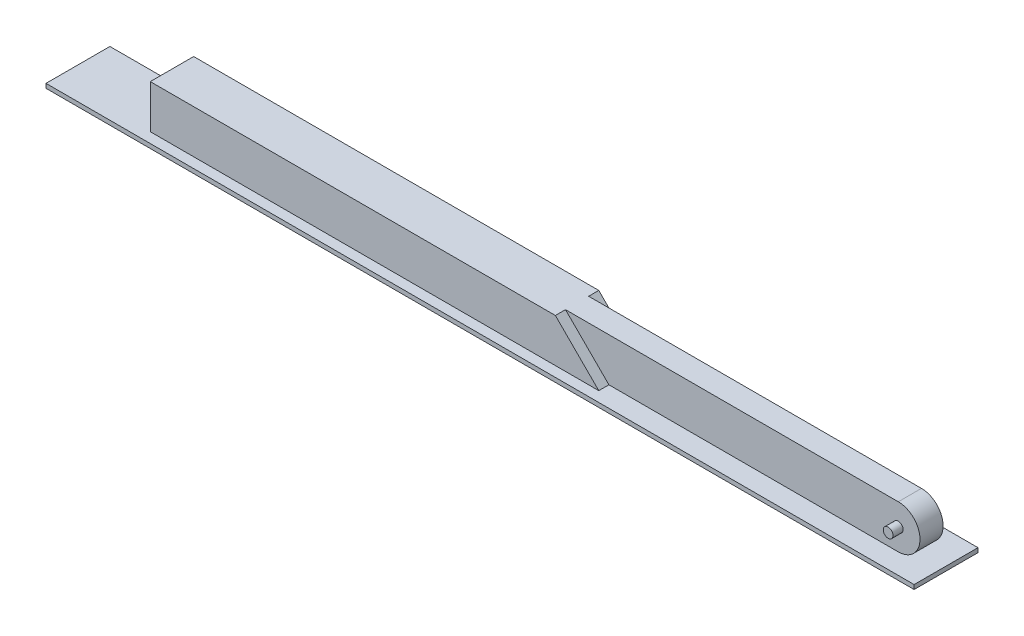
ISO-10303-21;
HEADER;
FILE_DESCRIPTION(('STEP AP214'),'2;1');
FILE_NAME('part.step','',(''),(''),'','','');
FILE_SCHEMA(('AUTOMOTIVE_DESIGN { 1 0 10303 214 1 1 1 1 }'));
ENDSEC;
DATA;
#1=APPLICATION_CONTEXT('core data for automotive mechanical design processes');
#2=APPLICATION_PROTOCOL_DEFINITION('international standard','automotive_design',2000,#1);
#3=PRODUCT_CONTEXT('',#1,'mechanical');
#4=PRODUCT('Part','Part','',(#3));
#5=PRODUCT_RELATED_PRODUCT_CATEGORY('part','',(#4));
#6=PRODUCT_DEFINITION_FORMATION('','',#4);
#7=PRODUCT_DEFINITION_CONTEXT('part definition',#1,'design');
#8=PRODUCT_DEFINITION('design','',#6,#7);
#9=PRODUCT_DEFINITION_SHAPE('','',#8);
#10=(LENGTH_UNIT() NAMED_UNIT(*) SI_UNIT(.MILLI.,.METRE.));
#11=(NAMED_UNIT(*) PLANE_ANGLE_UNIT() SI_UNIT($,.RADIAN.));
#12=(NAMED_UNIT(*) SI_UNIT($,.STERADIAN.) SOLID_ANGLE_UNIT());
#13=UNCERTAINTY_MEASURE_WITH_UNIT(LENGTH_MEASURE(1.E-05),#10,'distance_accuracy_value','');
#14=(GEOMETRIC_REPRESENTATION_CONTEXT(3) GLOBAL_UNCERTAINTY_ASSIGNED_CONTEXT((#13)) GLOBAL_UNIT_ASSIGNED_CONTEXT((#10,
#11,#12)) REPRESENTATION_CONTEXT('',''));
#15=CARTESIAN_POINT('',(0.,0.,0.));
#16=DIRECTION('',(0.,0.,1.));
#17=DIRECTION('',(1.,0.,0.));
#18=AXIS2_PLACEMENT_3D('',#15,#16,#17);
#19=CARTESIAN_POINT('',(225.,0.,15.));
#20=DIRECTION('',(0.,0.,-1.));
#21=DIRECTION('',(-1.,0.,0.));
#22=AXIS2_PLACEMENT_3D('',#19,#20,#21);
#23=CYLINDRICAL_SURFACE('',#22,15.);
#24=DIRECTION('',(0.,0.,-1.));
#25=VECTOR('',#24,1.);
#26=CARTESIAN_POINT('',(225.,-14.9999999999999,15.));
#27=LINE('',#26,#25);
#28=CARTESIAN_POINT('',(225.,-15.,8.));
#29=VERTEX_POINT('',#28);
#30=CARTESIAN_POINT('',(225.,-15.,-8.));
#31=VERTEX_POINT('',#30);
#32=EDGE_CURVE('E272',#29,#31,#27,.T.);
#33=ORIENTED_EDGE('',*,*,#32,.T.);
#34=CARTESIAN_POINT('',(225.,0.,-8.));
#35=DIRECTION('',(0.,0.,1.));
#36=DIRECTION('',(1.,0.,0.));
#37=AXIS2_PLACEMENT_3D('',#34,#35,#36);
#38=CIRCLE('',#37,15.);
#39=CARTESIAN_POINT('',(225.,15.0000000000001,-8.));
#40=VERTEX_POINT('',#39);
#41=EDGE_CURVE('E263',#31,#40,#38,.T.);
#42=ORIENTED_EDGE('',*,*,#41,.T.);
#43=DIRECTION('',(0.,0.,-1.));
#44=VECTOR('',#43,1.);
#45=CARTESIAN_POINT('',(225.,15.0000000000001,15.));
#46=LINE('',#45,#44);
#47=CARTESIAN_POINT('',(225.,15.0000000000001,8.));
#48=VERTEX_POINT('',#47);
#49=EDGE_CURVE('E269',#48,#40,#46,.T.);
#50=ORIENTED_EDGE('',*,*,#49,.F.);
#51=CARTESIAN_POINT('',(225.,0.,8.));
#52=DIRECTION('',(0.,0.,-1.));
#53=DIRECTION('',(-1.,0.,0.));
#54=AXIS2_PLACEMENT_3D('',#51,#52,#53);
#55=CIRCLE('',#54,15.);
#56=EDGE_CURVE('E259',#48,#29,#55,.T.);
#57=ORIENTED_EDGE('',*,*,#56,.T.);
#58=EDGE_LOOP('',(#33,#42,#50,#57));
#59=FACE_BOUND('',#58,.T.);
#60=ADVANCED_FACE('F37',(#59),#23,.T.);
#61=CARTESIAN_POINT('',(-225.,15.,15.));
#62=DIRECTION('',(0.,-1.,0.));
#63=DIRECTION('',(1.,0.,0.));
#64=AXIS2_PLACEMENT_3D('',#61,#62,#63);
#65=PLANE('',#64);
#66=DIRECTION('',(-1.,0.,0.));
#67=VECTOR('',#66,1.);
#68=CARTESIAN_POINT('',(-225.,15.,15.));
#69=LINE('',#68,#67);
#70=CARTESIAN_POINT('',(-5.00000000000014,15.,15.));
#71=VERTEX_POINT('',#70);
#72=CARTESIAN_POINT('',(-285.,15.,15.));
#73=VERTEX_POINT('',#72);
#74=EDGE_CURVE('E267',#71,#73,#69,.T.);
#75=ORIENTED_EDGE('',*,*,#74,.F.);
#76=DIRECTION('',(0.,0.,-1.));
#77=VECTOR('',#76,1.);
#78=CARTESIAN_POINT('',(-5.00000000000014,15.,15.));
#79=LINE('',#78,#77);
#80=CARTESIAN_POINT('',(-5.00000000000014,15.,8.));
#81=VERTEX_POINT('',#80);
#82=EDGE_CURVE('E282',#71,#81,#79,.T.);
#83=ORIENTED_EDGE('',*,*,#82,.T.);
#84=DIRECTION('',(-1.,0.,0.));
#85=VECTOR('',#84,1.);
#86=CARTESIAN_POINT('',(25.,15.,8.));
#87=LINE('',#86,#85);
#88=EDGE_CURVE('E53',#48,#81,#87,.T.);
#89=ORIENTED_EDGE('',*,*,#88,.F.);
#90=ORIENTED_EDGE('',*,*,#49,.T.);
#91=DIRECTION('',(1.,0.,0.));
#92=VECTOR('',#91,1.);
#93=CARTESIAN_POINT('',(25.,15.,-8.));
#94=LINE('',#93,#92);
#95=CARTESIAN_POINT('',(-5.00000000000014,15.,-8.));
#96=VERTEX_POINT('',#95);
#97=EDGE_CURVE('E61',#96,#40,#94,.T.);
#98=ORIENTED_EDGE('',*,*,#97,.F.);
#99=DIRECTION('',(0.,0.,-1.));
#100=VECTOR('',#99,1.);
#101=CARTESIAN_POINT('',(-5.00000000000014,15.,15.));
#102=LINE('',#101,#100);
#103=CARTESIAN_POINT('',(-5.00000000000014,15.,-15.));
#104=VERTEX_POINT('',#103);
#105=EDGE_CURVE('E280',#96,#104,#102,.T.);
#106=ORIENTED_EDGE('',*,*,#105,.T.);
#107=DIRECTION('',(-1.,0.,0.));
#108=VECTOR('',#107,1.);
#109=CARTESIAN_POINT('',(-225.,15.,-15.));
#110=LINE('',#109,#108);
#111=CARTESIAN_POINT('',(-285.,15.,-15.));
#112=VERTEX_POINT('',#111);
#113=EDGE_CURVE('E266',#104,#112,#110,.T.);
#114=ORIENTED_EDGE('',*,*,#113,.T.);
#115=DIRECTION('',(0.,0.,-1.));
#116=VECTOR('',#115,1.);
#117=CARTESIAN_POINT('',(-285.,15.,-66.2219080242626));
#118=LINE('',#117,#116);
#119=EDGE_CURVE('E192',#73,#112,#118,.T.);
#120=ORIENTED_EDGE('',*,*,#119,.F.);
#121=EDGE_LOOP('',(#75,#83,#89,#90,#98,#106,#114,#120));
#122=FACE_BOUND('',#121,.T.);
#123=ADVANCED_FACE('F315',(#122),#65,.F.);
#124=CARTESIAN_POINT('',(-225.,0.,15.));
#125=DIRECTION('',(0.,0.,1.));
#126=DIRECTION('',(1.,0.,0.));
#127=AXIS2_PLACEMENT_3D('',#124,#125,#126);
#128=PLANE('',#127);
#129=DIRECTION('',(1.,0.,0.));
#130=VECTOR('',#129,1.);
#131=CARTESIAN_POINT('',(-225.,-15.,15.));
#132=LINE('',#131,#130);
#133=CARTESIAN_POINT('',(-285.,-15.,15.));
#134=VERTEX_POINT('',#133);
#135=CARTESIAN_POINT('',(25.,-15.,15.));
#136=VERTEX_POINT('',#135);
#137=EDGE_CURVE('E241',#134,#136,#132,.T.);
#138=ORIENTED_EDGE('',*,*,#137,.T.);
#139=DIRECTION('',(0.707106781186548,-0.707106781186547,0.));
#140=VECTOR('',#139,1.);
#141=CARTESIAN_POINT('',(-107.5,117.5,15.));
#142=LINE('',#141,#140);
#143=EDGE_CURVE('E274',#136,#71,#142,.F.);
#144=ORIENTED_EDGE('',*,*,#143,.T.);
#145=ORIENTED_EDGE('',*,*,#74,.T.);
#146=DIRECTION('',(0.,1.,0.));
#147=VECTOR('',#146,1.);
#148=CARTESIAN_POINT('',(-285.,0.,15.));
#149=LINE('',#148,#147);
#150=EDGE_CURVE('E205',#134,#73,#149,.T.);
#151=ORIENTED_EDGE('',*,*,#150,.F.);
#152=EDGE_LOOP('',(#138,#144,#145,#151));
#153=FACE_BOUND('',#152,.T.);
#154=ADVANCED_FACE('F299',(#153),#128,.T.);
#155=CARTESIAN_POINT('',(-225.,0.,-15.));
#156=DIRECTION('',(0.,0.,1.));
#157=DIRECTION('',(1.,0.,0.));
#158=AXIS2_PLACEMENT_3D('',#155,#156,#157);
#159=PLANE('',#158);
#160=ORIENTED_EDGE('',*,*,#113,.F.);
#161=DIRECTION('',(-0.707106781186548,0.707106781186547,0.));
#162=VECTOR('',#161,1.);
#163=CARTESIAN_POINT('',(25.,-15.,-15.));
#164=LINE('',#163,#162);
#165=CARTESIAN_POINT('',(25.,-15.,-15.));
#166=VERTEX_POINT('',#165);
#167=EDGE_CURVE('E284',#104,#166,#164,.F.);
#168=ORIENTED_EDGE('',*,*,#167,.T.);
#169=DIRECTION('',(1.,0.,0.));
#170=VECTOR('',#169,1.);
#171=CARTESIAN_POINT('',(-225.,-15.,-15.));
#172=LINE('',#171,#170);
#173=CARTESIAN_POINT('',(-285.,-15.,-15.));
#174=VERTEX_POINT('',#173);
#175=EDGE_CURVE('E238',#174,#166,#172,.T.);
#176=ORIENTED_EDGE('',*,*,#175,.F.);
#177=DIRECTION('',(0.,1.,0.));
#178=VECTOR('',#177,1.);
#179=CARTESIAN_POINT('',(-285.,0.,-15.));
#180=LINE('',#179,#178);
#181=EDGE_CURVE('E202',#174,#112,#180,.T.);
#182=ORIENTED_EDGE('',*,*,#181,.T.);
#183=EDGE_LOOP('',(#160,#168,#176,#182));
#184=FACE_BOUND('',#183,.T.);
#185=ADVANCED_FACE('F305',(#184),#159,.F.);
#186=CARTESIAN_POINT('',(25.,-15.,8.));
#187=DIRECTION('',(0.,0.,-1.));
#188=DIRECTION('',(-1.,0.,0.));
#189=AXIS2_PLACEMENT_3D('',#186,#187,#188);
#190=PLANE('',#189);
#191=CARTESIAN_POINT('',(225.,0.,8.));
#192=DIRECTION('',(0.,0.,-1.));
#193=DIRECTION('',(-1.,0.,0.));
#194=AXIS2_PLACEMENT_3D('',#191,#192,#193);
#195=CIRCLE('',#194,3.3782);
#196=CARTESIAN_POINT('',(221.6218,0.,8.));
#197=VERTEX_POINT('',#196);
#198=EDGE_CURVE('E250',#197,#197,#195,.F.);
#199=ORIENTED_EDGE('',*,*,#198,.F.);
#200=EDGE_LOOP('',(#199));
#201=FACE_BOUND('',#200,.T.);
#202=ORIENTED_EDGE('',*,*,#88,.T.);
#203=DIRECTION('',(-0.707106781186548,0.707106781186547,0.));
#204=VECTOR('',#203,1.);
#205=CARTESIAN_POINT('',(25.,-15.,8.));
#206=LINE('',#205,#204);
#207=CARTESIAN_POINT('',(25.,-15.,8.));
#208=VERTEX_POINT('',#207);
#209=EDGE_CURVE('E46',#81,#208,#206,.F.);
#210=ORIENTED_EDGE('',*,*,#209,.T.);
#211=DIRECTION('',(-1.,0.,0.));
#212=VECTOR('',#211,1.);
#213=CARTESIAN_POINT('',(25.,-15.,8.));
#214=LINE('',#213,#212);
#215=EDGE_CURVE('E252',#29,#208,#214,.T.);
#216=ORIENTED_EDGE('',*,*,#215,.F.);
#217=ORIENTED_EDGE('',*,*,#56,.F.);
#218=EDGE_LOOP('',(#202,#210,#216,#217));
#219=FACE_BOUND('',#218,.T.);
#220=ADVANCED_FACE('F286',(#201,#219),#190,.F.);
#221=CARTESIAN_POINT('',(25.,-15.,-8.));
#222=DIRECTION('',(0.,0.,1.));
#223=DIRECTION('',(1.,0.,0.));
#224=AXIS2_PLACEMENT_3D('',#221,#222,#223);
#225=PLANE('',#224);
#226=CARTESIAN_POINT('',(225.,0.,-8.));
#227=DIRECTION('',(0.,0.,1.));
#228=DIRECTION('',(1.,0.,0.));
#229=AXIS2_PLACEMENT_3D('',#226,#227,#228);
#230=CIRCLE('',#229,3.3782);
#231=CARTESIAN_POINT('',(228.3782,0.,-8.));
#232=VERTEX_POINT('',#231);
#233=EDGE_CURVE('E262',#232,#232,#230,.F.);
#234=ORIENTED_EDGE('',*,*,#233,.F.);
#235=EDGE_LOOP('',(#234));
#236=FACE_BOUND('',#235,.T.);
#237=DIRECTION('',(1.,0.,0.));
#238=VECTOR('',#237,1.);
#239=CARTESIAN_POINT('',(25.,-15.,-8.));
#240=LINE('',#239,#238);
#241=CARTESIAN_POINT('',(25.,-15.,-8.));
#242=VERTEX_POINT('',#241);
#243=EDGE_CURVE('E247',#242,#31,#240,.T.);
#244=ORIENTED_EDGE('',*,*,#243,.F.);
#245=DIRECTION('',(0.707106781186548,-0.707106781186547,0.));
#246=VECTOR('',#245,1.);
#247=CARTESIAN_POINT('',(25.,-15.,-8.));
#248=LINE('',#247,#246);
#249=EDGE_CURVE('E11',#242,#96,#248,.F.);
#250=ORIENTED_EDGE('',*,*,#249,.T.);
#251=ORIENTED_EDGE('',*,*,#97,.T.);
#252=ORIENTED_EDGE('',*,*,#41,.F.);
#253=EDGE_LOOP('',(#244,#250,#251,#252));
#254=FACE_BOUND('',#253,.T.);
#255=ADVANCED_FACE('F312',(#236,#254),#225,.F.);
#256=CARTESIAN_POINT('',(250.02,-17.9999999999999,22.0794863015094));
#257=DIRECTION('',(-1.,0.,0.));
#258=DIRECTION('',(0.,-1.,0.));
#259=AXIS2_PLACEMENT_3D('',#256,#257,#258);
#260=PLANE('',#259);
#261=DIRECTION('',(0.,0.,1.));
#262=VECTOR('',#261,1.);
#263=CARTESIAN_POINT('',(250.02,-14.9999999999999,22.0794863015094));
#264=LINE('',#263,#262);
#265=CARTESIAN_POINT('',(250.02,-14.9999999999999,-22.0794863015094));
#266=VERTEX_POINT('',#265);
#267=CARTESIAN_POINT('',(250.02,-14.9999999999999,22.0794863015094));
#268=VERTEX_POINT('',#267);
#269=EDGE_CURVE('E208',#266,#268,#264,.T.);
#270=ORIENTED_EDGE('',*,*,#269,.T.);
#271=DIRECTION('',(0.,1.,0.));
#272=VECTOR('',#271,1.);
#273=CARTESIAN_POINT('',(250.02,-17.9999999999999,22.0794863015094));
#274=LINE('',#273,#272);
#275=CARTESIAN_POINT('',(250.02,-17.9999999999999,22.0794863015094));
#276=VERTEX_POINT('',#275);
#277=EDGE_CURVE('E235',#276,#268,#274,.T.);
#278=ORIENTED_EDGE('',*,*,#277,.F.);
#279=DIRECTION('',(0.,0.,1.));
#280=VECTOR('',#279,1.);
#281=CARTESIAN_POINT('',(250.02,-17.9999999999999,22.0794863015094));
#282=LINE('',#281,#280);
#283=CARTESIAN_POINT('',(250.02,-17.9999999999999,-22.0794863015094));
#284=VERTEX_POINT('',#283);
#285=EDGE_CURVE('E209',#284,#276,#282,.T.);
#286=ORIENTED_EDGE('',*,*,#285,.F.);
#287=DIRECTION('',(0.,1.,0.));
#288=VECTOR('',#287,1.);
#289=CARTESIAN_POINT('',(250.02,-17.9999999999999,-22.0794863015094));
#290=LINE('',#289,#288);
#291=EDGE_CURVE('E219',#284,#266,#290,.T.);
#292=ORIENTED_EDGE('',*,*,#291,.T.);
#293=EDGE_LOOP('',(#270,#278,#286,#292));
#294=FACE_BOUND('',#293,.T.);
#295=ADVANCED_FACE('F390',(#294),#260,.F.);
#296=CARTESIAN_POINT('',(-349.98,-18.,22.0794863015093));
#297=DIRECTION('',(0.,0.,-1.));
#298=DIRECTION('',(-1.,0.,0.));
#299=AXIS2_PLACEMENT_3D('',#296,#297,#298);
#300=PLANE('',#299);
#301=DIRECTION('',(-1.,0.,0.));
#302=VECTOR('',#301,1.);
#303=CARTESIAN_POINT('',(-349.98,-15.,22.0794863015093));
#304=LINE('',#303,#302);
#305=CARTESIAN_POINT('',(-349.98,-15.,22.0794863015093));
#306=VERTEX_POINT('',#305);
#307=EDGE_CURVE('E222',#268,#306,#304,.T.);
#308=ORIENTED_EDGE('',*,*,#307,.T.);
#309=DIRECTION('',(0.,1.,0.));
#310=VECTOR('',#309,1.);
#311=CARTESIAN_POINT('',(-349.98,-18.,22.0794863015093));
#312=LINE('',#311,#310);
#313=CARTESIAN_POINT('',(-349.98,-18.,22.0794863015093));
#314=VERTEX_POINT('',#313);
#315=EDGE_CURVE('E232',#314,#306,#312,.T.);
#316=ORIENTED_EDGE('',*,*,#315,.F.);
#317=DIRECTION('',(-1.,0.,0.));
#318=VECTOR('',#317,1.);
#319=CARTESIAN_POINT('',(-349.98,-18.,22.0794863015093));
#320=LINE('',#319,#318);
#321=EDGE_CURVE('E212',#276,#314,#320,.T.);
#322=ORIENTED_EDGE('',*,*,#321,.F.);
#323=ORIENTED_EDGE('',*,*,#277,.T.);
#324=EDGE_LOOP('',(#308,#316,#322,#323));
#325=FACE_BOUND('',#324,.T.);
#326=ADVANCED_FACE('F386',(#325),#300,.F.);
#327=CARTESIAN_POINT('',(-349.98,-18.,22.0794863015093));
#328=DIRECTION('',(1.,0.,0.));
#329=DIRECTION('',(0.,1.,0.));
#330=AXIS2_PLACEMENT_3D('',#327,#328,#329);
#331=PLANE('',#330);
#332=DIRECTION('',(0.,0.,-1.));
#333=VECTOR('',#332,1.);
#334=CARTESIAN_POINT('',(-349.98,-15.,22.0794863015093));
#335=LINE('',#334,#333);
#336=CARTESIAN_POINT('',(-349.98,-15.,-22.0794863015093));
#337=VERTEX_POINT('',#336);
#338=EDGE_CURVE('E224',#306,#337,#335,.T.);
#339=ORIENTED_EDGE('',*,*,#338,.T.);
#340=DIRECTION('',(0.,1.,0.));
#341=VECTOR('',#340,1.);
#342=CARTESIAN_POINT('',(-349.98,-18.,-22.0794863015093));
#343=LINE('',#342,#341);
#344=CARTESIAN_POINT('',(-349.98,-18.,-22.0794863015093));
#345=VERTEX_POINT('',#344);
#346=EDGE_CURVE('E229',#345,#337,#343,.T.);
#347=ORIENTED_EDGE('',*,*,#346,.F.);
#348=DIRECTION('',(0.,0.,-1.));
#349=VECTOR('',#348,1.);
#350=CARTESIAN_POINT('',(-349.98,-18.,22.0794863015093));
#351=LINE('',#350,#349);
#352=EDGE_CURVE('E215',#314,#345,#351,.T.);
#353=ORIENTED_EDGE('',*,*,#352,.F.);
#354=ORIENTED_EDGE('',*,*,#315,.T.);
#355=EDGE_LOOP('',(#339,#347,#353,#354));
#356=FACE_BOUND('',#355,.T.);
#357=ADVANCED_FACE('F382',(#356),#331,.F.);
#358=CARTESIAN_POINT('',(-349.98,-18.,-22.0794863015093));
#359=DIRECTION('',(0.,0.,1.));
#360=DIRECTION('',(1.,0.,0.));
#361=AXIS2_PLACEMENT_3D('',#358,#359,#360);
#362=PLANE('',#361);
#363=DIRECTION('',(1.,0.,0.));
#364=VECTOR('',#363,1.);
#365=CARTESIAN_POINT('',(-349.98,-15.,-22.0794863015093));
#366=LINE('',#365,#364);
#367=EDGE_CURVE('E213',#337,#266,#366,.T.);
#368=ORIENTED_EDGE('',*,*,#367,.T.);
#369=ORIENTED_EDGE('',*,*,#291,.F.);
#370=DIRECTION('',(1.,0.,0.));
#371=VECTOR('',#370,1.);
#372=CARTESIAN_POINT('',(-349.98,-18.,-22.0794863015093));
#373=LINE('',#372,#371);
#374=EDGE_CURVE('E217',#345,#284,#373,.T.);
#375=ORIENTED_EDGE('',*,*,#374,.F.);
#376=ORIENTED_EDGE('',*,*,#346,.T.);
#377=EDGE_LOOP('',(#368,#369,#375,#376));
#378=FACE_BOUND('',#377,.T.);
#379=ADVANCED_FACE('F376',(#378),#362,.F.);
#380=CARTESIAN_POINT('',(0.,-18.,0.));
#381=DIRECTION('',(0.,-1.,0.));
#382=DIRECTION('',(1.,0.,0.));
#383=AXIS2_PLACEMENT_3D('',#380,#381,#382);
#384=PLANE('',#383);
#385=ORIENTED_EDGE('',*,*,#285,.T.);
#386=ORIENTED_EDGE('',*,*,#321,.T.);
#387=ORIENTED_EDGE('',*,*,#352,.T.);
#388=ORIENTED_EDGE('',*,*,#374,.T.);
#389=EDGE_LOOP('',(#385,#386,#387,#388));
#390=FACE_BOUND('',#389,.T.);
#391=ADVANCED_FACE('F373',(#390),#384,.T.);
#392=CARTESIAN_POINT('',(0.,-15.,0.));
#393=DIRECTION('',(0.,-1.,0.));
#394=DIRECTION('',(1.,0.,0.));
#395=AXIS2_PLACEMENT_3D('',#392,#393,#394);
#396=PLANE('',#395);
#397=ORIENTED_EDGE('',*,*,#137,.F.);
#398=DIRECTION('',(0.,0.,-1.));
#399=VECTOR('',#398,1.);
#400=CARTESIAN_POINT('',(-285.,-15.,-66.2219080242626));
#401=LINE('',#400,#399);
#402=EDGE_CURVE('E199',#134,#174,#401,.T.);
#403=ORIENTED_EDGE('',*,*,#402,.T.);
#404=ORIENTED_EDGE('',*,*,#175,.T.);
#405=DIRECTION('',(0.,0.,1.));
#406=VECTOR('',#405,1.);
#407=CARTESIAN_POINT('',(25.,-15.,-28.9161112376698));
#408=LINE('',#407,#406);
#409=EDGE_CURVE('E244',#166,#242,#408,.T.);
#410=ORIENTED_EDGE('',*,*,#409,.T.);
#411=ORIENTED_EDGE('',*,*,#243,.T.);
#412=ORIENTED_EDGE('',*,*,#32,.F.);
#413=ORIENTED_EDGE('',*,*,#215,.T.);
#414=DIRECTION('',(0.,0.,1.));
#415=VECTOR('',#414,1.);
#416=CARTESIAN_POINT('',(25.,-15.,28.9161112376696));
#417=LINE('',#416,#415);
#418=EDGE_CURVE('E253',#208,#136,#417,.T.);
#419=ORIENTED_EDGE('',*,*,#418,.T.);
#420=EDGE_LOOP('',(#397,#403,#404,#410,#411,#412,#413,#419));
#421=FACE_BOUND('',#420,.T.);
#422=ORIENTED_EDGE('',*,*,#269,.F.);
#423=ORIENTED_EDGE('',*,*,#367,.F.);
#424=ORIENTED_EDGE('',*,*,#338,.F.);
#425=ORIENTED_EDGE('',*,*,#307,.F.);
#426=EDGE_LOOP('',(#422,#423,#424,#425));
#427=FACE_BOUND('',#426,.T.);
#428=ADVANCED_FACE('F293',(#421,#427),#396,.F.);
#429=CARTESIAN_POINT('',(-285.,-310.650604957821,-66.2219080242626));
#430=DIRECTION('',(1.,0.,0.));
#431=DIRECTION('',(0.,1.,0.));
#432=AXIS2_PLACEMENT_3D('',#429,#430,#431);
#433=PLANE('',#432);
#434=ORIENTED_EDGE('',*,*,#150,.T.);
#435=ORIENTED_EDGE('',*,*,#119,.T.);
#436=ORIENTED_EDGE('',*,*,#181,.F.);
#437=ORIENTED_EDGE('',*,*,#402,.F.);
#438=EDGE_LOOP('',(#434,#435,#436,#437));
#439=FACE_BOUND('',#438,.T.);
#440=DIRECTION('',(0.,0.,-1.));
#441=VECTOR('',#440,1.);
#442=CARTESIAN_POINT('',(-285.,9.35,-6.35));
#443=LINE('',#442,#441);
#444=CARTESIAN_POINT('',(-285.,9.35000000000002,6.34999999999999));
#445=VERTEX_POINT('',#444);
#446=CARTESIAN_POINT('',(-285.,9.35,-6.35));
#447=VERTEX_POINT('',#446);
#448=EDGE_CURVE('E187',#445,#447,#443,.T.);
#449=ORIENTED_EDGE('',*,*,#448,.F.);
#450=DIRECTION('',(0.,1.,0.));
#451=VECTOR('',#450,1.);
#452=CARTESIAN_POINT('',(-285.,-3.35,6.35));
#453=LINE('',#452,#451);
#454=CARTESIAN_POINT('',(-285.,-3.35,6.35));
#455=VERTEX_POINT('',#454);
#456=EDGE_CURVE('E158',#455,#445,#453,.T.);
#457=ORIENTED_EDGE('',*,*,#456,.F.);
#458=DIRECTION('',(0.,0.,1.));
#459=VECTOR('',#458,1.);
#460=CARTESIAN_POINT('',(-285.,-3.35,-6.35));
#461=LINE('',#460,#459);
#462=CARTESIAN_POINT('',(-285.,-3.35,-6.35));
#463=VERTEX_POINT('',#462);
#464=EDGE_CURVE('E176',#463,#455,#461,.T.);
#465=ORIENTED_EDGE('',*,*,#464,.F.);
#466=DIRECTION('',(0.,-1.,0.));
#467=VECTOR('',#466,1.);
#468=CARTESIAN_POINT('',(-285.,-3.35,-6.35));
#469=LINE('',#468,#467);
#470=EDGE_CURVE('E178',#447,#463,#469,.T.);
#471=ORIENTED_EDGE('',*,*,#470,.F.);
#472=EDGE_LOOP('',(#449,#457,#465,#471));
#473=FACE_BOUND('',#472,.T.);
#474=ADVANCED_FACE('F317',(#439,#473),#433,.F.);
#475=CARTESIAN_POINT('',(100.,-3.34999999999993,6.35));
#476=DIRECTION('',(0.,0.,1.));
#477=DIRECTION('',(1.,0.,0.));
#478=AXIS2_PLACEMENT_3D('',#475,#476,#477);
#479=PLANE('',#478);
#480=ORIENTED_EDGE('',*,*,#456,.T.);
#481=DIRECTION('',(-1.,0.,0.));
#482=VECTOR('',#481,1.);
#483=CARTESIAN_POINT('',(100.,9.35000000000007,6.35));
#484=LINE('',#483,#482);
#485=CARTESIAN_POINT('',(100.,9.35000000000007,6.35));
#486=VERTEX_POINT('',#485);
#487=EDGE_CURVE('E150',#486,#445,#484,.T.);
#488=ORIENTED_EDGE('',*,*,#487,.F.);
#489=DIRECTION('',(0.,1.,0.));
#490=VECTOR('',#489,1.);
#491=CARTESIAN_POINT('',(100.,-3.34999999999993,6.35));
#492=LINE('',#491,#490);
#493=CARTESIAN_POINT('',(100.,-3.34999999999993,6.35));
#494=VERTEX_POINT('',#493);
#495=EDGE_CURVE('E155',#494,#486,#492,.T.);
#496=ORIENTED_EDGE('',*,*,#495,.F.);
#497=DIRECTION('',(-1.,0.,0.));
#498=VECTOR('',#497,1.);
#499=CARTESIAN_POINT('',(100.,-3.34999999999993,6.35));
#500=LINE('',#499,#498);
#501=EDGE_CURVE('E190',#494,#455,#500,.T.);
#502=ORIENTED_EDGE('',*,*,#501,.T.);
#503=EDGE_LOOP('',(#480,#488,#496,#502));
#504=FACE_BOUND('',#503,.T.);
#505=ADVANCED_FACE('F152',(#504),#479,.F.);
#506=CARTESIAN_POINT('',(100.,-3.34999999999993,-6.35));
#507=DIRECTION('',(0.,-1.,0.));
#508=DIRECTION('',(1.,0.,0.));
#509=AXIS2_PLACEMENT_3D('',#506,#507,#508);
#510=PLANE('',#509);
#511=ORIENTED_EDGE('',*,*,#464,.T.);
#512=ORIENTED_EDGE('',*,*,#501,.F.);
#513=DIRECTION('',(0.,0.,1.));
#514=VECTOR('',#513,1.);
#515=CARTESIAN_POINT('',(100.,-3.34999999999993,-6.35));
#516=LINE('',#515,#514);
#517=CARTESIAN_POINT('',(100.,-3.34999999999993,-6.35));
#518=VERTEX_POINT('',#517);
#519=EDGE_CURVE('E163',#518,#494,#516,.T.);
#520=ORIENTED_EDGE('',*,*,#519,.F.);
#521=DIRECTION('',(-1.,0.,0.));
#522=VECTOR('',#521,1.);
#523=CARTESIAN_POINT('',(100.,-3.34999999999993,-6.35));
#524=LINE('',#523,#522);
#525=EDGE_CURVE('E193',#518,#463,#524,.T.);
#526=ORIENTED_EDGE('',*,*,#525,.T.);
#527=EDGE_LOOP('',(#511,#512,#520,#526));
#528=FACE_BOUND('',#527,.T.);
#529=ADVANCED_FACE('F325',(#528),#510,.F.);
#530=CARTESIAN_POINT('',(100.,-3.34999999999993,-6.35));
#531=DIRECTION('',(0.,0.,-1.));
#532=DIRECTION('',(-1.,0.,0.));
#533=AXIS2_PLACEMENT_3D('',#530,#531,#532);
#534=PLANE('',#533);
#535=DIRECTION('',(-1.,0.,0.));
#536=VECTOR('',#535,1.);
#537=CARTESIAN_POINT('',(100.,9.35000000000007,-6.35));
#538=LINE('',#537,#536);
#539=CARTESIAN_POINT('',(100.,9.35000000000007,-6.35));
#540=VERTEX_POINT('',#539);
#541=EDGE_CURVE('E162',#540,#447,#538,.T.);
#542=ORIENTED_EDGE('',*,*,#541,.T.);
#543=ORIENTED_EDGE('',*,*,#470,.T.);
#544=ORIENTED_EDGE('',*,*,#525,.F.);
#545=DIRECTION('',(0.,-1.,0.));
#546=VECTOR('',#545,1.);
#547=CARTESIAN_POINT('',(100.,-3.34999999999993,-6.35));
#548=LINE('',#547,#546);
#549=EDGE_CURVE('E172',#540,#518,#548,.T.);
#550=ORIENTED_EDGE('',*,*,#549,.F.);
#551=EDGE_LOOP('',(#542,#543,#544,#550));
#552=FACE_BOUND('',#551,.T.);
#553=ADVANCED_FACE('F323',(#552),#534,.F.);
#554=CARTESIAN_POINT('',(100.,9.35000000000007,-6.35));
#555=DIRECTION('',(0.,1.,0.));
#556=DIRECTION('',(-1.,0.,0.));
#557=AXIS2_PLACEMENT_3D('',#554,#555,#556);
#558=PLANE('',#557);
#559=ORIENTED_EDGE('',*,*,#448,.T.);
#560=ORIENTED_EDGE('',*,*,#541,.F.);
#561=DIRECTION('',(0.,0.,-1.));
#562=VECTOR('',#561,1.);
#563=CARTESIAN_POINT('',(100.,9.35000000000007,-6.35));
#564=LINE('',#563,#562);
#565=EDGE_CURVE('E166',#486,#540,#564,.T.);
#566=ORIENTED_EDGE('',*,*,#565,.F.);
#567=ORIENTED_EDGE('',*,*,#487,.T.);
#568=EDGE_LOOP('',(#559,#560,#566,#567));
#569=FACE_BOUND('',#568,.T.);
#570=ADVANCED_FACE('F167',(#569),#558,.F.);
#571=CARTESIAN_POINT('',(100.,0.,0.));
#572=DIRECTION('',(1.,0.,0.));
#573=DIRECTION('',(0.,0.,-1.));
#574=AXIS2_PLACEMENT_3D('',#571,#572,#573);
#575=PLANE('',#574);
#576=ORIENTED_EDGE('',*,*,#495,.T.);
#577=ORIENTED_EDGE('',*,*,#565,.T.);
#578=ORIENTED_EDGE('',*,*,#549,.T.);
#579=ORIENTED_EDGE('',*,*,#519,.T.);
#580=EDGE_LOOP('',(#576,#577,#578,#579));
#581=FACE_BOUND('',#580,.T.);
#582=ADVANCED_FACE('F174',(#581),#575,.F.);
#583=CARTESIAN_POINT('',(-225.,0.,-15.));
#584=DIRECTION('',(0.,0.,1.));
#585=DIRECTION('',(1.,0.,0.));
#586=AXIS2_PLACEMENT_3D('',#583,#584,#585);
#587=PLANE('',#586);
#588=CARTESIAN_POINT('',(225.,0.,-15.));
#589=DIRECTION('',(0.,0.,1.));
#590=DIRECTION('',(1.,0.,0.));
#591=AXIS2_PLACEMENT_3D('',#588,#589,#590);
#592=CIRCLE('',#591,3.37819999999999);
#593=CARTESIAN_POINT('',(228.3782,0.,-15.));
#594=VERTEX_POINT('',#593);
#595=EDGE_CURVE('E552',#594,#594,#592,.F.);
#596=ORIENTED_EDGE('',*,*,#595,.T.);
#597=EDGE_LOOP('',(#596));
#598=FACE_BOUND('',#597,.T.);
#599=ADVANCED_FACE('F363',(#598),#587,.F.);
#600=CARTESIAN_POINT('',(225.,0.,24.5549925128176));
#601=DIRECTION('',(0.,0.,-1.));
#602=DIRECTION('',(-1.,0.,0.));
#603=AXIS2_PLACEMENT_3D('',#600,#601,#602);
#604=CYLINDRICAL_SURFACE('',#603,3.37819999999999);
#605=ORIENTED_EDGE('',*,*,#595,.F.);
#606=EDGE_LOOP('',(#605));
#607=FACE_BOUND('',#606,.T.);
#608=ORIENTED_EDGE('',*,*,#233,.T.);
#609=EDGE_LOOP('',(#608));
#610=FACE_BOUND('',#609,.T.);
#611=ADVANCED_FACE('F357',(#607,#610),#604,.T.);
#612=CARTESIAN_POINT('',(225.,0.,15.));
#613=DIRECTION('',(0.,0.,1.));
#614=DIRECTION('',(1.,0.,0.));
#615=AXIS2_PLACEMENT_3D('',#612,#613,#614);
#616=CIRCLE('',#615,3.37819999999999);
#617=CARTESIAN_POINT('',(228.3782,0.,15.));
#618=VERTEX_POINT('',#617);
#619=EDGE_CURVE('E181',#618,#618,#616,.T.);
#620=ORIENTED_EDGE('',*,*,#619,.F.);
#621=EDGE_LOOP('',(#620));
#622=FACE_BOUND('',#621,.T.);
#623=ORIENTED_EDGE('',*,*,#198,.T.);
#624=EDGE_LOOP('',(#623));
#625=FACE_BOUND('',#624,.T.);
#626=ADVANCED_FACE('F351',(#622,#625),#604,.T.);
#627=CARTESIAN_POINT('',(-225.,0.,15.));
#628=DIRECTION('',(0.,0.,1.));
#629=DIRECTION('',(1.,0.,0.));
#630=AXIS2_PLACEMENT_3D('',#627,#628,#629);
#631=PLANE('',#630);
#632=ORIENTED_EDGE('',*,*,#619,.T.);
#633=EDGE_LOOP('',(#632));
#634=FACE_BOUND('',#633,.T.);
#635=ADVANCED_FACE('F346',(#634),#631,.T.);
#636=CARTESIAN_POINT('',(25.,-15.,28.9161112376696));
#637=DIRECTION('',(-0.707106781186547,-0.707106781186548,0.));
#638=DIRECTION('',(0.,0.,1.));
#639=AXIS2_PLACEMENT_3D('',#636,#637,#638);
#640=PLANE('',#639);
#641=ORIENTED_EDGE('',*,*,#209,.F.);
#642=ORIENTED_EDGE('',*,*,#82,.F.);
#643=ORIENTED_EDGE('',*,*,#143,.F.);
#644=ORIENTED_EDGE('',*,*,#418,.F.);
#645=EDGE_LOOP('',(#641,#642,#643,#644));
#646=FACE_BOUND('',#645,.T.);
#647=ADVANCED_FACE('F295',(#646),#640,.F.);
#648=CARTESIAN_POINT('',(25.,-15.,-28.9161112376698));
#649=DIRECTION('',(-0.707106781186547,-0.707106781186548,0.));
#650=DIRECTION('',(0.,0.,1.));
#651=AXIS2_PLACEMENT_3D('',#648,#649,#650);
#652=PLANE('',#651);
#653=ORIENTED_EDGE('',*,*,#167,.F.);
#654=ORIENTED_EDGE('',*,*,#105,.F.);
#655=ORIENTED_EDGE('',*,*,#249,.F.);
#656=ORIENTED_EDGE('',*,*,#409,.F.);
#657=EDGE_LOOP('',(#653,#654,#655,#656));
#658=FACE_BOUND('',#657,.T.);
#659=ADVANCED_FACE('F40',(#658),#652,.F.);
#660=CLOSED_SHELL('',(#60,#123,#154,#185,#220,#255,#295,#326,#357,#379,#391,#428,#474,#505,#529,
#553,#570,#582,#599,#611,#626,#635,#647,#659));
#661=MANIFOLD_SOLID_BREP('B2',#660);
#662=ADVANCED_BREP_SHAPE_REPRESENTATION('',(#18,#661),#14);
#663=SHAPE_DEFINITION_REPRESENTATION(#9,#662);
ENDSEC;
END-ISO-10303-21;
